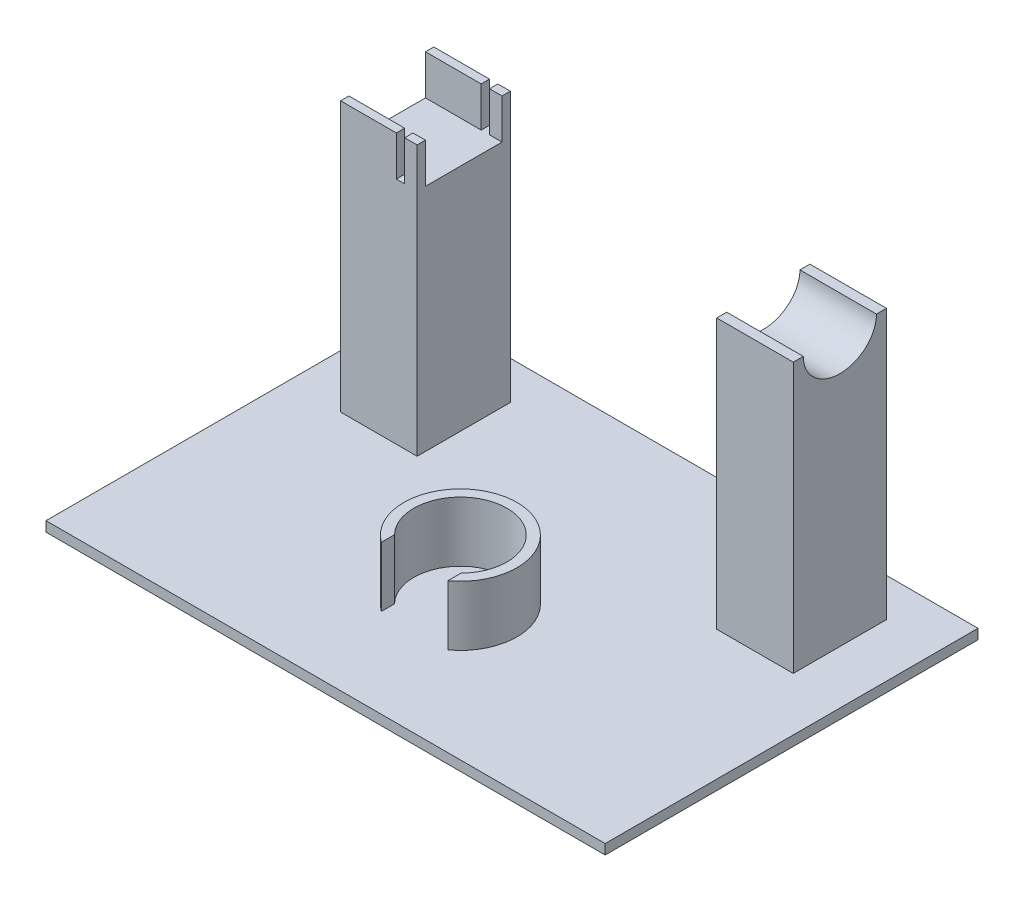
ISO-10303-21;
HEADER;
FILE_DESCRIPTION(('STEP AP214'),'2;1');
FILE_NAME('part.step','',(''),(''),'','','');
FILE_SCHEMA(('AUTOMOTIVE_DESIGN { 1 0 10303 214 1 1 1 1 }'));
ENDSEC;
DATA;
#1=APPLICATION_CONTEXT('core data for automotive mechanical design processes');
#2=APPLICATION_PROTOCOL_DEFINITION('international standard','automotive_design',2000,#1);
#3=PRODUCT_CONTEXT('',#1,'mechanical');
#4=PRODUCT('Part','Part','',(#3));
#5=PRODUCT_RELATED_PRODUCT_CATEGORY('part','',(#4));
#6=PRODUCT_DEFINITION_FORMATION('','',#4);
#7=PRODUCT_DEFINITION_CONTEXT('part definition',#1,'design');
#8=PRODUCT_DEFINITION('design','',#6,#7);
#9=PRODUCT_DEFINITION_SHAPE('','',#8);
#10=(LENGTH_UNIT() NAMED_UNIT(*) SI_UNIT(.MILLI.,.METRE.));
#11=(NAMED_UNIT(*) PLANE_ANGLE_UNIT() SI_UNIT($,.RADIAN.));
#12=(NAMED_UNIT(*) SI_UNIT($,.STERADIAN.) SOLID_ANGLE_UNIT());
#13=UNCERTAINTY_MEASURE_WITH_UNIT(LENGTH_MEASURE(1.E-05),#10,'distance_accuracy_value','');
#14=(GEOMETRIC_REPRESENTATION_CONTEXT(3) GLOBAL_UNCERTAINTY_ASSIGNED_CONTEXT((#13)) GLOBAL_UNIT_ASSIGNED_CONTEXT((#10,
#11,#12)) REPRESENTATION_CONTEXT('',''));
#15=CARTESIAN_POINT('',(0.,0.,0.));
#16=DIRECTION('',(0.,0.,1.));
#17=DIRECTION('',(1.,0.,0.));
#18=AXIS2_PLACEMENT_3D('',#15,#16,#17);
#19=CARTESIAN_POINT('',(0.,84.,0.));
#20=DIRECTION('',(0.,1.,0.));
#21=DIRECTION('',(0.,0.,1.));
#22=AXIS2_PLACEMENT_3D('',#19,#20,#21);
#23=PLANE('',#22);
#24=DIRECTION('',(-1.,0.,0.));
#25=VECTOR('',#24,1.);
#26=CARTESIAN_POINT('',(85.,84.,-41.5));
#27=LINE('',#26,#25);
#28=CARTESIAN_POINT('',(68.,84.,-41.5));
#29=VERTEX_POINT('',#28);
#30=CARTESIAN_POINT('',(45.,84.,-41.5));
#31=VERTEX_POINT('',#30);
#32=EDGE_CURVE('E45',#29,#31,#27,.T.);
#33=ORIENTED_EDGE('',*,*,#32,.F.);
#34=DIRECTION('',(0.,0.,1.));
#35=VECTOR('',#34,1.);
#36=CARTESIAN_POINT('',(68.,84.,-44.5));
#37=LINE('',#36,#35);
#38=CARTESIAN_POINT('',(68.,84.,-44.5));
#39=VERTEX_POINT('',#38);
#40=EDGE_CURVE('E374',#39,#29,#37,.T.);
#41=ORIENTED_EDGE('',*,*,#40,.F.);
#42=DIRECTION('',(-1.,0.,0.));
#43=VECTOR('',#42,1.);
#44=CARTESIAN_POINT('',(68.,84.,-44.5));
#45=LINE('',#44,#43);
#46=CARTESIAN_POINT('',(45.,84.,-44.5));
#47=VERTEX_POINT('',#46);
#48=EDGE_CURVE('E384',#39,#47,#45,.T.);
#49=ORIENTED_EDGE('',*,*,#48,.T.);
#50=DIRECTION('',(0.,0.,1.));
#51=VECTOR('',#50,1.);
#52=CARTESIAN_POINT('',(45.,84.,-44.5));
#53=LINE('',#52,#51);
#54=EDGE_CURVE('E376',#47,#31,#53,.T.);
#55=ORIENTED_EDGE('',*,*,#54,.T.);
#56=EDGE_LOOP('',(#33,#41,#49,#55));
#57=FACE_BOUND('',#56,.T.);
#58=ADVANCED_FACE('F37',(#57),#23,.T.);
#59=CARTESIAN_POINT('',(0.,84.,0.));
#60=DIRECTION('',(0.,1.,0.));
#61=DIRECTION('',(0.,0.,1.));
#62=AXIS2_PLACEMENT_3D('',#59,#60,#61);
#63=PLANE('',#62);
#64=DIRECTION('',(1.,0.,0.));
#65=VECTOR('',#64,1.);
#66=CARTESIAN_POINT('',(0.,84.,-42.));
#67=LINE('',#66,#65);
#68=CARTESIAN_POINT('',(-68.,84.,-42.));
#69=VERTEX_POINT('',#68);
#70=CARTESIAN_POINT('',(-51.25,84.,-42.));
#71=VERTEX_POINT('',#70);
#72=EDGE_CURVE('E488',#69,#71,#67,.T.);
#73=ORIENTED_EDGE('',*,*,#72,.T.);
#74=DIRECTION('',(0.,0.,1.));
#75=VECTOR('',#74,1.);
#76=CARTESIAN_POINT('',(-51.25,84.,-47.3449468279757));
#77=LINE('',#76,#75);
#78=CARTESIAN_POINT('',(-51.25,84.,-44.5));
#79=VERTEX_POINT('',#78);
#80=EDGE_CURVE('E578',#79,#71,#77,.T.);
#81=ORIENTED_EDGE('',*,*,#80,.F.);
#82=DIRECTION('',(1.,0.,0.));
#83=VECTOR('',#82,1.);
#84=CARTESIAN_POINT('',(-68.,84.,-44.5));
#85=LINE('',#84,#83);
#86=CARTESIAN_POINT('',(-68.,84.,-44.5));
#87=VERTEX_POINT('',#86);
#88=EDGE_CURVE('E430',#87,#79,#85,.T.);
#89=ORIENTED_EDGE('',*,*,#88,.F.);
#90=DIRECTION('',(0.,0.,1.));
#91=VECTOR('',#90,1.);
#92=CARTESIAN_POINT('',(-68.,84.,-44.5));
#93=LINE('',#92,#91);
#94=EDGE_CURVE('E417',#87,#69,#93,.T.);
#95=ORIENTED_EDGE('',*,*,#94,.T.);
#96=EDGE_LOOP('',(#73,#81,#89,#95));
#97=FACE_BOUND('',#96,.T.);
#98=ADVANCED_FACE('F326',(#97),#63,.T.);
#99=CARTESIAN_POINT('',(-68.,84.,-16.5));
#100=DIRECTION('',(0.,0.,-1.));
#101=DIRECTION('',(-1.,0.,0.));
#102=AXIS2_PLACEMENT_3D('',#99,#100,#101);
#103=PLANE('',#102);
#104=DIRECTION('',(0.,-1.,0.));
#105=VECTOR('',#104,1.);
#106=CARTESIAN_POINT('',(-51.25,84.,-16.5));
#107=LINE('',#106,#105);
#108=CARTESIAN_POINT('',(-51.25,84.,-16.5));
#109=VERTEX_POINT('',#108);
#110=CARTESIAN_POINT('',(-51.25,72.,-16.5));
#111=VERTEX_POINT('',#110);
#112=EDGE_CURVE('E563',#109,#111,#107,.T.);
#113=ORIENTED_EDGE('',*,*,#112,.F.);
#114=DIRECTION('',(1.,0.,0.));
#115=VECTOR('',#114,1.);
#116=CARTESIAN_POINT('',(-68.,84.,-16.5));
#117=LINE('',#116,#115);
#118=CARTESIAN_POINT('',(-68.,84.,-16.5));
#119=VERTEX_POINT('',#118);
#120=EDGE_CURVE('E422',#119,#109,#117,.T.);
#121=ORIENTED_EDGE('',*,*,#120,.F.);
#122=DIRECTION('',(0.,-1.,0.));
#123=VECTOR('',#122,1.);
#124=CARTESIAN_POINT('',(-68.,84.,-16.5));
#125=LINE('',#124,#123);
#126=CARTESIAN_POINT('',(-68.,3.,-16.5));
#127=VERTEX_POINT('',#126);
#128=EDGE_CURVE('E451',#119,#127,#125,.T.);
#129=ORIENTED_EDGE('',*,*,#128,.T.);
#130=DIRECTION('',(1.,0.,0.));
#131=VECTOR('',#130,1.);
#132=CARTESIAN_POINT('',(-68.,3.,-16.5));
#133=LINE('',#132,#131);
#134=CARTESIAN_POINT('',(-45.,3.,-16.5));
#135=VERTEX_POINT('',#134);
#136=EDGE_CURVE('E436',#127,#135,#133,.T.);
#137=ORIENTED_EDGE('',*,*,#136,.T.);
#138=DIRECTION('',(0.,-1.,0.));
#139=VECTOR('',#138,1.);
#140=CARTESIAN_POINT('',(-45.,84.,-16.5));
#141=LINE('',#140,#139);
#142=CARTESIAN_POINT('',(-45.,84.,-16.5));
#143=VERTEX_POINT('',#142);
#144=EDGE_CURVE('E449',#143,#135,#141,.T.);
#145=ORIENTED_EDGE('',*,*,#144,.F.);
#146=CARTESIAN_POINT('',(-48.75,84.,-16.5));
#147=VERTEX_POINT('',#146);
#148=EDGE_CURVE('E420',#147,#143,#117,.T.);
#149=ORIENTED_EDGE('',*,*,#148,.F.);
#150=DIRECTION('',(0.,-1.,0.));
#151=VECTOR('',#150,1.);
#152=CARTESIAN_POINT('',(-48.75,84.,-16.5));
#153=LINE('',#152,#151);
#154=CARTESIAN_POINT('',(-48.75,72.,-16.5));
#155=VERTEX_POINT('',#154);
#156=EDGE_CURVE('E576',#147,#155,#153,.T.);
#157=ORIENTED_EDGE('',*,*,#156,.T.);
#158=DIRECTION('',(-1.,0.,0.));
#159=VECTOR('',#158,1.);
#160=CARTESIAN_POINT('',(-68.,72.,-16.5));
#161=LINE('',#160,#159);
#162=EDGE_CURVE('E565',#155,#111,#161,.T.);
#163=ORIENTED_EDGE('',*,*,#162,.T.);
#164=EDGE_LOOP('',(#113,#121,#129,#137,#145,#149,#157,#163));
#165=FACE_BOUND('',#164,.T.);
#166=ADVANCED_FACE('F332',(#165),#103,.F.);
#167=CARTESIAN_POINT('',(-68.,84.,-44.5));
#168=DIRECTION('',(0.,0.,-1.));
#169=DIRECTION('',(-1.,0.,0.));
#170=AXIS2_PLACEMENT_3D('',#167,#168,#169);
#171=PLANE('',#170);
#172=ORIENTED_EDGE('',*,*,#88,.T.);
#173=DIRECTION('',(0.,-1.,0.));
#174=VECTOR('',#173,1.);
#175=CARTESIAN_POINT('',(-51.25,84.,-44.5));
#176=LINE('',#175,#174);
#177=CARTESIAN_POINT('',(-51.25,72.,-44.5));
#178=VERTEX_POINT('',#177);
#179=EDGE_CURVE('E567',#79,#178,#176,.T.);
#180=ORIENTED_EDGE('',*,*,#179,.T.);
#181=DIRECTION('',(-1.,0.,0.));
#182=VECTOR('',#181,1.);
#183=CARTESIAN_POINT('',(-68.,72.,-44.5));
#184=LINE('',#183,#182);
#185=CARTESIAN_POINT('',(-48.75,72.,-44.5));
#186=VERTEX_POINT('',#185);
#187=EDGE_CURVE('E580',#186,#178,#184,.T.);
#188=ORIENTED_EDGE('',*,*,#187,.F.);
#189=DIRECTION('',(0.,-1.,0.));
#190=VECTOR('',#189,1.);
#191=CARTESIAN_POINT('',(-48.75,84.,-44.5));
#192=LINE('',#191,#190);
#193=CARTESIAN_POINT('',(-48.75,84.,-44.5));
#194=VERTEX_POINT('',#193);
#195=EDGE_CURVE('E596',#194,#186,#192,.T.);
#196=ORIENTED_EDGE('',*,*,#195,.F.);
#197=CARTESIAN_POINT('',(-45.,84.,-44.5));
#198=VERTEX_POINT('',#197);
#199=EDGE_CURVE('E429',#194,#198,#85,.T.);
#200=ORIENTED_EDGE('',*,*,#199,.T.);
#201=DIRECTION('',(0.,-1.,0.));
#202=VECTOR('',#201,1.);
#203=CARTESIAN_POINT('',(-45.,84.,-44.5));
#204=LINE('',#203,#202);
#205=CARTESIAN_POINT('',(-45.,3.,-44.5));
#206=VERTEX_POINT('',#205);
#207=EDGE_CURVE('E446',#198,#206,#204,.T.);
#208=ORIENTED_EDGE('',*,*,#207,.T.);
#209=DIRECTION('',(1.,0.,0.));
#210=VECTOR('',#209,1.);
#211=CARTESIAN_POINT('',(-68.,3.,-44.5));
#212=LINE('',#211,#210);
#213=CARTESIAN_POINT('',(-68.,3.,-44.5));
#214=VERTEX_POINT('',#213);
#215=EDGE_CURVE('E442',#214,#206,#212,.T.);
#216=ORIENTED_EDGE('',*,*,#215,.F.);
#217=DIRECTION('',(0.,-1.,0.));
#218=VECTOR('',#217,1.);
#219=CARTESIAN_POINT('',(-68.,84.,-44.5));
#220=LINE('',#219,#218);
#221=EDGE_CURVE('E433',#87,#214,#220,.T.);
#222=ORIENTED_EDGE('',*,*,#221,.F.);
#223=EDGE_LOOP('',(#172,#180,#188,#196,#200,#208,#216,#222));
#224=FACE_BOUND('',#223,.T.);
#225=ADVANCED_FACE('F328',(#224),#171,.T.);
#226=ORIENTED_EDGE('',*,*,#120,.T.);
#227=CARTESIAN_POINT('',(-51.25,84.,-19.));
#228=VERTEX_POINT('',#227);
#229=EDGE_CURVE('E608',#228,#109,#77,.T.);
#230=ORIENTED_EDGE('',*,*,#229,.F.);
#231=DIRECTION('',(1.,0.,0.));
#232=VECTOR('',#231,1.);
#233=CARTESIAN_POINT('',(0.,84.,-19.));
#234=LINE('',#233,#232);
#235=CARTESIAN_POINT('',(-68.,84.,-19.));
#236=VERTEX_POINT('',#235);
#237=EDGE_CURVE('E484',#236,#228,#234,.T.);
#238=ORIENTED_EDGE('',*,*,#237,.F.);
#239=EDGE_CURVE('E421',#236,#119,#93,.T.);
#240=ORIENTED_EDGE('',*,*,#239,.T.);
#241=EDGE_LOOP('',(#226,#230,#238,#240));
#242=FACE_BOUND('',#241,.T.);
#243=ADVANCED_FACE('F331',(#242),#63,.T.);
#244=CARTESIAN_POINT('',(-73.,72.,-42.));
#245=DIRECTION('',(0.,0.,1.));
#246=DIRECTION('',(1.,0.,0.));
#247=AXIS2_PLACEMENT_3D('',#244,#245,#246);
#248=PLANE('',#247);
#249=DIRECTION('',(1.,0.,0.));
#250=VECTOR('',#249,1.);
#251=CARTESIAN_POINT('',(-73.,72.,-42.));
#252=LINE('',#251,#250);
#253=CARTESIAN_POINT('',(-68.,72.,-42.));
#254=VERTEX_POINT('',#253);
#255=CARTESIAN_POINT('',(-51.25,72.,-42.));
#256=VERTEX_POINT('',#255);
#257=EDGE_CURVE('E540',#254,#256,#252,.T.);
#258=ORIENTED_EDGE('',*,*,#257,.T.);
#259=DIRECTION('',(0.,1.,0.));
#260=VECTOR('',#259,1.);
#261=CARTESIAN_POINT('',(-51.25,72.,-42.));
#262=LINE('',#261,#260);
#263=EDGE_CURVE('E570',#256,#71,#262,.T.);
#264=ORIENTED_EDGE('',*,*,#263,.T.);
#265=ORIENTED_EDGE('',*,*,#72,.F.);
#266=DIRECTION('',(0.,-1.,0.));
#267=VECTOR('',#266,1.);
#268=CARTESIAN_POINT('',(-68.,84.,-42.));
#269=LINE('',#268,#267);
#270=EDGE_CURVE('E537',#69,#254,#269,.T.);
#271=ORIENTED_EDGE('',*,*,#270,.T.);
#272=EDGE_LOOP('',(#258,#264,#265,#271));
#273=FACE_BOUND('',#272,.T.);
#274=ADVANCED_FACE('F297',(#273),#248,.T.);
#275=CARTESIAN_POINT('',(-73.,72.,-19.));
#276=DIRECTION('',(0.,0.,1.));
#277=DIRECTION('',(1.,0.,0.));
#278=AXIS2_PLACEMENT_3D('',#275,#276,#277);
#279=PLANE('',#278);
#280=DIRECTION('',(0.,1.,0.));
#281=VECTOR('',#280,1.);
#282=CARTESIAN_POINT('',(-51.25,72.,-19.));
#283=LINE('',#282,#281);
#284=CARTESIAN_POINT('',(-51.25,72.,-19.));
#285=VERTEX_POINT('',#284);
#286=EDGE_CURVE('E494',#285,#228,#283,.T.);
#287=ORIENTED_EDGE('',*,*,#286,.F.);
#288=DIRECTION('',(1.,0.,0.));
#289=VECTOR('',#288,1.);
#290=CARTESIAN_POINT('',(-73.,72.,-19.));
#291=LINE('',#290,#289);
#292=CARTESIAN_POINT('',(-68.,72.,-19.));
#293=VERTEX_POINT('',#292);
#294=EDGE_CURVE('E551',#293,#285,#291,.T.);
#295=ORIENTED_EDGE('',*,*,#294,.F.);
#296=DIRECTION('',(0.,-1.,0.));
#297=VECTOR('',#296,1.);
#298=CARTESIAN_POINT('',(-68.,84.,-19.));
#299=LINE('',#298,#297);
#300=EDGE_CURVE('E533',#236,#293,#299,.T.);
#301=ORIENTED_EDGE('',*,*,#300,.F.);
#302=ORIENTED_EDGE('',*,*,#237,.T.);
#303=EDGE_LOOP('',(#287,#295,#301,#302));
#304=FACE_BOUND('',#303,.T.);
#305=ADVANCED_FACE('F301',(#304),#279,.F.);
#306=CARTESIAN_POINT('',(-68.,84.,-44.5));
#307=DIRECTION('',(1.,0.,0.));
#308=DIRECTION('',(0.,0.,-1.));
#309=AXIS2_PLACEMENT_3D('',#306,#307,#308);
#310=PLANE('',#309);
#311=ORIENTED_EDGE('',*,*,#270,.F.);
#312=ORIENTED_EDGE('',*,*,#94,.F.);
#313=ORIENTED_EDGE('',*,*,#221,.T.);
#314=DIRECTION('',(0.,0.,1.));
#315=VECTOR('',#314,1.);
#316=CARTESIAN_POINT('',(-68.,3.,-44.5));
#317=LINE('',#316,#315);
#318=EDGE_CURVE('E416',#214,#127,#317,.T.);
#319=ORIENTED_EDGE('',*,*,#318,.T.);
#320=ORIENTED_EDGE('',*,*,#128,.F.);
#321=ORIENTED_EDGE('',*,*,#239,.F.);
#322=ORIENTED_EDGE('',*,*,#300,.T.);
#323=DIRECTION('',(0.,0.,1.));
#324=VECTOR('',#323,1.);
#325=CARTESIAN_POINT('',(-68.,72.,-44.5));
#326=LINE('',#325,#324);
#327=EDGE_CURVE('E391',#254,#293,#326,.T.);
#328=ORIENTED_EDGE('',*,*,#327,.F.);
#329=EDGE_LOOP('',(#311,#312,#313,#319,#320,#321,#322,#328));
#330=FACE_BOUND('',#329,.T.);
#331=ADVANCED_FACE('F337',(#330),#310,.F.);
#332=CARTESIAN_POINT('',(-45.,84.,-44.5));
#333=DIRECTION('',(1.,0.,0.));
#334=DIRECTION('',(0.,0.,-1.));
#335=AXIS2_PLACEMENT_3D('',#332,#333,#334);
#336=PLANE('',#335);
#337=DIRECTION('',(0.,0.,1.));
#338=VECTOR('',#337,1.);
#339=CARTESIAN_POINT('',(-45.,84.,-44.5));
#340=LINE('',#339,#338);
#341=CARTESIAN_POINT('',(-45.,84.,-42.));
#342=VERTEX_POINT('',#341);
#343=EDGE_CURVE('E426',#198,#342,#340,.T.);
#344=ORIENTED_EDGE('',*,*,#343,.T.);
#345=DIRECTION('',(0.,1.,0.));
#346=VECTOR('',#345,1.);
#347=CARTESIAN_POINT('',(-45.,72.,-42.));
#348=LINE('',#347,#346);
#349=CARTESIAN_POINT('',(-45.,72.,-42.));
#350=VERTEX_POINT('',#349);
#351=EDGE_CURVE('E528',#350,#342,#348,.T.);
#352=ORIENTED_EDGE('',*,*,#351,.F.);
#353=DIRECTION('',(0.,0.,1.));
#354=VECTOR('',#353,1.);
#355=CARTESIAN_POINT('',(-45.,72.,-42.));
#356=LINE('',#355,#354);
#357=CARTESIAN_POINT('',(-45.,72.,-19.));
#358=VERTEX_POINT('',#357);
#359=EDGE_CURVE('E555',#350,#358,#356,.T.);
#360=ORIENTED_EDGE('',*,*,#359,.T.);
#361=DIRECTION('',(0.,1.,0.));
#362=VECTOR('',#361,1.);
#363=CARTESIAN_POINT('',(-45.,72.,-19.));
#364=LINE('',#363,#362);
#365=CARTESIAN_POINT('',(-45.,84.,-19.));
#366=VERTEX_POINT('',#365);
#367=EDGE_CURVE('E534',#358,#366,#364,.T.);
#368=ORIENTED_EDGE('',*,*,#367,.T.);
#369=EDGE_CURVE('E425',#366,#143,#340,.T.);
#370=ORIENTED_EDGE('',*,*,#369,.T.);
#371=ORIENTED_EDGE('',*,*,#144,.T.);
#372=DIRECTION('',(0.,0.,1.));
#373=VECTOR('',#372,1.);
#374=CARTESIAN_POINT('',(-45.,3.,-44.5));
#375=LINE('',#374,#373);
#376=EDGE_CURVE('E439',#206,#135,#375,.T.);
#377=ORIENTED_EDGE('',*,*,#376,.F.);
#378=ORIENTED_EDGE('',*,*,#207,.F.);
#379=EDGE_LOOP('',(#344,#352,#360,#368,#370,#371,#377,#378));
#380=FACE_BOUND('',#379,.T.);
#381=ADVANCED_FACE('F334',(#380),#336,.T.);
#382=DIRECTION('',(0.,0.,1.));
#383=VECTOR('',#382,1.);
#384=CARTESIAN_POINT('',(-48.75,84.,-47.3449468279757));
#385=LINE('',#384,#383);
#386=CARTESIAN_POINT('',(-48.75,84.,-42.));
#387=VERTEX_POINT('',#386);
#388=EDGE_CURVE('E526',#194,#387,#385,.T.);
#389=ORIENTED_EDGE('',*,*,#388,.T.);
#390=EDGE_CURVE('E487',#387,#342,#67,.T.);
#391=ORIENTED_EDGE('',*,*,#390,.T.);
#392=ORIENTED_EDGE('',*,*,#343,.F.);
#393=ORIENTED_EDGE('',*,*,#199,.F.);
#394=EDGE_LOOP('',(#389,#391,#392,#393));
#395=FACE_BOUND('',#394,.T.);
#396=ADVANCED_FACE('F327',(#395),#63,.T.);
#397=CARTESIAN_POINT('',(0.,3.,0.));
#398=DIRECTION('',(0.,-1.,0.));
#399=DIRECTION('',(0.,0.,-1.));
#400=AXIS2_PLACEMENT_3D('',#397,#398,#399);
#401=PLANE('',#400);
#402=CARTESIAN_POINT('',(0.,3.,15.5));
#403=DIRECTION('',(0.,-1.,0.));
#404=DIRECTION('',(0.,0.,-1.));
#405=AXIS2_PLACEMENT_3D('',#402,#403,#404);
#406=CIRCLE('',#405,17.);
#407=CARTESIAN_POINT('',(10.,3.,29.2477270848675));
#408=VERTEX_POINT('',#407);
#409=CARTESIAN_POINT('',(-10.,3.,29.2477270848675));
#410=VERTEX_POINT('',#409);
#411=EDGE_CURVE('E11',#408,#410,#406,.F.);
#412=ORIENTED_EDGE('',*,*,#411,.F.);
#413=DIRECTION('',(0.,0.,-1.));
#414=VECTOR('',#413,1.);
#415=CARTESIAN_POINT('',(10.,3.,19.5960604290662));
#416=LINE('',#415,#414);
#417=CARTESIAN_POINT('',(10.,3.,25.2979589711327));
#418=VERTEX_POINT('',#417);
#419=EDGE_CURVE('E52',#408,#418,#416,.T.);
#420=ORIENTED_EDGE('',*,*,#419,.T.);
#421=CARTESIAN_POINT('',(0.,3.,15.5));
#422=DIRECTION('',(0.,1.,0.));
#423=DIRECTION('',(0.,0.,1.));
#424=AXIS2_PLACEMENT_3D('',#421,#422,#423);
#425=CIRCLE('',#424,14.);
#426=CARTESIAN_POINT('',(-10.,3.,25.2979589711327));
#427=VERTEX_POINT('',#426);
#428=EDGE_CURVE('E259',#418,#427,#425,.T.);
#429=ORIENTED_EDGE('',*,*,#428,.T.);
#430=DIRECTION('',(0.,0.,1.));
#431=VECTOR('',#430,1.);
#432=CARTESIAN_POINT('',(-10.,3.,19.5960604290662));
#433=LINE('',#432,#431);
#434=EDGE_CURVE('E240',#427,#410,#433,.T.);
#435=ORIENTED_EDGE('',*,*,#434,.T.);
#436=EDGE_LOOP('',(#412,#420,#429,#435));
#437=FACE_BOUND('',#436,.T.);
#438=DIRECTION('',(-1.,0.,0.));
#439=VECTOR('',#438,1.);
#440=CARTESIAN_POINT('',(68.,3.,-44.5));
#441=LINE('',#440,#439);
#442=CARTESIAN_POINT('',(68.,3.,-44.5));
#443=VERTEX_POINT('',#442);
#444=CARTESIAN_POINT('',(45.,3.,-44.5));
#445=VERTEX_POINT('',#444);
#446=EDGE_CURVE('E402',#443,#445,#441,.T.);
#447=ORIENTED_EDGE('',*,*,#446,.F.);
#448=DIRECTION('',(0.,0.,1.));
#449=VECTOR('',#448,1.);
#450=CARTESIAN_POINT('',(68.,3.,-44.5));
#451=LINE('',#450,#449);
#452=CARTESIAN_POINT('',(68.,3.,-16.5));
#453=VERTEX_POINT('',#452);
#454=EDGE_CURVE('E399',#443,#453,#451,.T.);
#455=ORIENTED_EDGE('',*,*,#454,.T.);
#456=DIRECTION('',(-1.,0.,0.));
#457=VECTOR('',#456,1.);
#458=CARTESIAN_POINT('',(68.,3.,-16.5));
#459=LINE('',#458,#457);
#460=CARTESIAN_POINT('',(45.,3.,-16.5));
#461=VERTEX_POINT('',#460);
#462=EDGE_CURVE('E389',#453,#461,#459,.T.);
#463=ORIENTED_EDGE('',*,*,#462,.T.);
#464=DIRECTION('',(0.,0.,1.));
#465=VECTOR('',#464,1.);
#466=CARTESIAN_POINT('',(45.,3.,-44.5));
#467=LINE('',#466,#465);
#468=EDGE_CURVE('E404',#445,#461,#467,.T.);
#469=ORIENTED_EDGE('',*,*,#468,.F.);
#470=EDGE_LOOP('',(#447,#455,#463,#469));
#471=FACE_BOUND('',#470,.T.);
#472=DIRECTION('',(1.,0.,0.));
#473=VECTOR('',#472,1.);
#474=CARTESIAN_POINT('',(-84.,3.,-56.));
#475=LINE('',#474,#473);
#476=CARTESIAN_POINT('',(-84.,3.,-56.));
#477=VERTEX_POINT('',#476);
#478=CARTESIAN_POINT('',(84.,3.,-56.));
#479=VERTEX_POINT('',#478);
#480=EDGE_CURVE('E454',#477,#479,#475,.T.);
#481=ORIENTED_EDGE('',*,*,#480,.F.);
#482=DIRECTION('',(0.,0.,1.));
#483=VECTOR('',#482,1.);
#484=CARTESIAN_POINT('',(-84.,3.,-56.));
#485=LINE('',#484,#483);
#486=CARTESIAN_POINT('',(-84.,3.,56.));
#487=VERTEX_POINT('',#486);
#488=EDGE_CURVE('E463',#477,#487,#485,.T.);
#489=ORIENTED_EDGE('',*,*,#488,.T.);
#490=DIRECTION('',(1.,0.,0.));
#491=VECTOR('',#490,1.);
#492=CARTESIAN_POINT('',(-84.,3.,56.));
#493=LINE('',#492,#491);
#494=CARTESIAN_POINT('',(84.,3.,56.));
#495=VERTEX_POINT('',#494);
#496=EDGE_CURVE('E461',#487,#495,#493,.T.);
#497=ORIENTED_EDGE('',*,*,#496,.T.);
#498=DIRECTION('',(0.,0.,1.));
#499=VECTOR('',#498,1.);
#500=CARTESIAN_POINT('',(84.,3.,-56.));
#501=LINE('',#500,#499);
#502=EDGE_CURVE('E457',#479,#495,#501,.T.);
#503=ORIENTED_EDGE('',*,*,#502,.F.);
#504=EDGE_LOOP('',(#481,#489,#497,#503));
#505=FACE_BOUND('',#504,.T.);
#506=ORIENTED_EDGE('',*,*,#318,.F.);
#507=ORIENTED_EDGE('',*,*,#215,.T.);
#508=ORIENTED_EDGE('',*,*,#376,.T.);
#509=ORIENTED_EDGE('',*,*,#136,.F.);
#510=EDGE_LOOP('',(#506,#507,#508,#509));
#511=FACE_BOUND('',#510,.T.);
#512=ADVANCED_FACE('F345',(#437,#471,#505,#511),#401,.F.);
#513=CARTESIAN_POINT('',(-84.,3.,-56.));
#514=DIRECTION('',(0.,0.,-1.));
#515=DIRECTION('',(-1.,0.,0.));
#516=AXIS2_PLACEMENT_3D('',#513,#514,#515);
#517=PLANE('',#516);
#518=DIRECTION('',(1.,0.,0.));
#519=VECTOR('',#518,1.);
#520=CARTESIAN_POINT('',(-84.,0.,-56.));
#521=LINE('',#520,#519);
#522=CARTESIAN_POINT('',(-84.,0.,-56.));
#523=VERTEX_POINT('',#522);
#524=CARTESIAN_POINT('',(84.,0.,-56.));
#525=VERTEX_POINT('',#524);
#526=EDGE_CURVE('E453',#523,#525,#521,.T.);
#527=ORIENTED_EDGE('',*,*,#526,.F.);
#528=DIRECTION('',(0.,-1.,0.));
#529=VECTOR('',#528,1.);
#530=CARTESIAN_POINT('',(-84.,3.,-56.));
#531=LINE('',#530,#529);
#532=EDGE_CURVE('E475',#477,#523,#531,.T.);
#533=ORIENTED_EDGE('',*,*,#532,.F.);
#534=ORIENTED_EDGE('',*,*,#480,.T.);
#535=DIRECTION('',(0.,-1.,0.));
#536=VECTOR('',#535,1.);
#537=CARTESIAN_POINT('',(84.,3.,-56.));
#538=LINE('',#537,#536);
#539=EDGE_CURVE('E465',#479,#525,#538,.T.);
#540=ORIENTED_EDGE('',*,*,#539,.T.);
#541=EDGE_LOOP('',(#527,#533,#534,#540));
#542=FACE_BOUND('',#541,.T.);
#543=ADVANCED_FACE('F39',(#542),#517,.T.);
#544=CARTESIAN_POINT('',(-84.,3.,-56.));
#545=DIRECTION('',(1.,0.,0.));
#546=DIRECTION('',(0.,0.,-1.));
#547=AXIS2_PLACEMENT_3D('',#544,#545,#546);
#548=PLANE('',#547);
#549=DIRECTION('',(0.,0.,1.));
#550=VECTOR('',#549,1.);
#551=CARTESIAN_POINT('',(-84.,0.,-56.));
#552=LINE('',#551,#550);
#553=CARTESIAN_POINT('',(-84.,0.,56.));
#554=VERTEX_POINT('',#553);
#555=EDGE_CURVE('E458',#523,#554,#552,.T.);
#556=ORIENTED_EDGE('',*,*,#555,.T.);
#557=DIRECTION('',(0.,-1.,0.));
#558=VECTOR('',#557,1.);
#559=CARTESIAN_POINT('',(-84.,3.,56.));
#560=LINE('',#559,#558);
#561=EDGE_CURVE('E478',#487,#554,#560,.T.);
#562=ORIENTED_EDGE('',*,*,#561,.F.);
#563=ORIENTED_EDGE('',*,*,#488,.F.);
#564=ORIENTED_EDGE('',*,*,#532,.T.);
#565=EDGE_LOOP('',(#556,#562,#563,#564));
#566=FACE_BOUND('',#565,.T.);
#567=ADVANCED_FACE('F352',(#566),#548,.F.);
#568=CARTESIAN_POINT('',(-84.,3.,56.));
#569=DIRECTION('',(0.,0.,-1.));
#570=DIRECTION('',(-1.,0.,0.));
#571=AXIS2_PLACEMENT_3D('',#568,#569,#570);
#572=PLANE('',#571);
#573=DIRECTION('',(1.,0.,0.));
#574=VECTOR('',#573,1.);
#575=CARTESIAN_POINT('',(-84.,0.,56.));
#576=LINE('',#575,#574);
#577=CARTESIAN_POINT('',(84.,0.,56.));
#578=VERTEX_POINT('',#577);
#579=EDGE_CURVE('E471',#554,#578,#576,.T.);
#580=ORIENTED_EDGE('',*,*,#579,.T.);
#581=DIRECTION('',(0.,-1.,0.));
#582=VECTOR('',#581,1.);
#583=CARTESIAN_POINT('',(84.,3.,56.));
#584=LINE('',#583,#582);
#585=EDGE_CURVE('E481',#495,#578,#584,.T.);
#586=ORIENTED_EDGE('',*,*,#585,.F.);
#587=ORIENTED_EDGE('',*,*,#496,.F.);
#588=ORIENTED_EDGE('',*,*,#561,.T.);
#589=EDGE_LOOP('',(#580,#586,#587,#588));
#590=FACE_BOUND('',#589,.T.);
#591=ADVANCED_FACE('F355',(#590),#572,.F.);
#592=CARTESIAN_POINT('',(84.,3.,-56.));
#593=DIRECTION('',(1.,0.,0.));
#594=DIRECTION('',(0.,0.,-1.));
#595=AXIS2_PLACEMENT_3D('',#592,#593,#594);
#596=PLANE('',#595);
#597=DIRECTION('',(0.,0.,1.));
#598=VECTOR('',#597,1.);
#599=CARTESIAN_POINT('',(84.,0.,-56.));
#600=LINE('',#599,#598);
#601=EDGE_CURVE('E468',#525,#578,#600,.T.);
#602=ORIENTED_EDGE('',*,*,#601,.F.);
#603=ORIENTED_EDGE('',*,*,#539,.F.);
#604=ORIENTED_EDGE('',*,*,#502,.T.);
#605=ORIENTED_EDGE('',*,*,#585,.T.);
#606=EDGE_LOOP('',(#602,#603,#604,#605));
#607=FACE_BOUND('',#606,.T.);
#608=ADVANCED_FACE('F350',(#607),#596,.T.);
#609=CARTESIAN_POINT('',(0.,0.,0.));
#610=DIRECTION('',(0.,-1.,0.));
#611=DIRECTION('',(0.,0.,-1.));
#612=AXIS2_PLACEMENT_3D('',#609,#610,#611);
#613=PLANE('',#612);
#614=ORIENTED_EDGE('',*,*,#526,.T.);
#615=ORIENTED_EDGE('',*,*,#601,.T.);
#616=ORIENTED_EDGE('',*,*,#579,.F.);
#617=ORIENTED_EDGE('',*,*,#555,.F.);
#618=EDGE_LOOP('',(#614,#615,#616,#617));
#619=FACE_BOUND('',#618,.T.);
#620=ADVANCED_FACE('F324',(#619),#613,.T.);
#621=CARTESIAN_POINT('',(-48.75,84.,-19.));
#622=VERTEX_POINT('',#621);
#623=EDGE_CURVE('E582',#622,#147,#385,.T.);
#624=ORIENTED_EDGE('',*,*,#623,.T.);
#625=ORIENTED_EDGE('',*,*,#148,.T.);
#626=ORIENTED_EDGE('',*,*,#369,.F.);
#627=EDGE_CURVE('E477',#622,#366,#234,.T.);
#628=ORIENTED_EDGE('',*,*,#627,.F.);
#629=EDGE_LOOP('',(#624,#625,#626,#628));
#630=FACE_BOUND('',#629,.T.);
#631=ADVANCED_FACE('F320',(#630),#63,.T.);
#632=CARTESIAN_POINT('',(68.,84.,-44.5));
#633=DIRECTION('',(1.,0.,0.));
#634=DIRECTION('',(0.,0.,-1.));
#635=AXIS2_PLACEMENT_3D('',#632,#633,#634);
#636=PLANE('',#635);
#637=CARTESIAN_POINT('',(68.,84.,-30.5));
#638=DIRECTION('',(-1.,0.,0.));
#639=DIRECTION('',(0.,0.,1.));
#640=AXIS2_PLACEMENT_3D('',#637,#638,#639);
#641=ELLIPSE('',#640,11.,9.99999999999999);
#642=CARTESIAN_POINT('',(68.,84.,-19.5));
#643=VERTEX_POINT('',#642);
#644=EDGE_CURVE('E379',#643,#29,#641,.F.);
#645=ORIENTED_EDGE('',*,*,#644,.F.);
#646=CARTESIAN_POINT('',(68.,84.,-16.5));
#647=VERTEX_POINT('',#646);
#648=EDGE_CURVE('E385',#643,#647,#37,.T.);
#649=ORIENTED_EDGE('',*,*,#648,.T.);
#650=DIRECTION('',(0.,-1.,0.));
#651=VECTOR('',#650,1.);
#652=CARTESIAN_POINT('',(68.,84.,-16.5));
#653=LINE('',#652,#651);
#654=EDGE_CURVE('E398',#647,#453,#653,.T.);
#655=ORIENTED_EDGE('',*,*,#654,.T.);
#656=ORIENTED_EDGE('',*,*,#454,.F.);
#657=DIRECTION('',(0.,-1.,0.));
#658=VECTOR('',#657,1.);
#659=CARTESIAN_POINT('',(68.,84.,-44.5));
#660=LINE('',#659,#658);
#661=EDGE_CURVE('E382',#39,#443,#660,.T.);
#662=ORIENTED_EDGE('',*,*,#661,.F.);
#663=ORIENTED_EDGE('',*,*,#40,.T.);
#664=EDGE_LOOP('',(#645,#649,#655,#656,#662,#663));
#665=FACE_BOUND('',#664,.T.);
#666=ADVANCED_FACE('F316',(#665),#636,.T.);
#667=CARTESIAN_POINT('',(68.,84.,-44.5));
#668=DIRECTION('',(0.,0.,1.));
#669=DIRECTION('',(1.,0.,0.));
#670=AXIS2_PLACEMENT_3D('',#667,#668,#669);
#671=PLANE('',#670);
#672=ORIENTED_EDGE('',*,*,#446,.T.);
#673=DIRECTION('',(0.,-1.,0.));
#674=VECTOR('',#673,1.);
#675=CARTESIAN_POINT('',(45.,84.,-44.5));
#676=LINE('',#675,#674);
#677=EDGE_CURVE('E412',#47,#445,#676,.T.);
#678=ORIENTED_EDGE('',*,*,#677,.F.);
#679=ORIENTED_EDGE('',*,*,#48,.F.);
#680=ORIENTED_EDGE('',*,*,#661,.T.);
#681=EDGE_LOOP('',(#672,#678,#679,#680));
#682=FACE_BOUND('',#681,.T.);
#683=ADVANCED_FACE('F312',(#682),#671,.F.);
#684=CARTESIAN_POINT('',(45.,84.,-44.5));
#685=DIRECTION('',(1.,0.,0.));
#686=DIRECTION('',(0.,0.,-1.));
#687=AXIS2_PLACEMENT_3D('',#684,#685,#686);
#688=PLANE('',#687);
#689=CARTESIAN_POINT('',(45.,84.,-19.5));
#690=VERTEX_POINT('',#689);
#691=CARTESIAN_POINT('',(45.,84.,-16.5));
#692=VERTEX_POINT('',#691);
#693=EDGE_CURVE('E387',#690,#692,#53,.T.);
#694=ORIENTED_EDGE('',*,*,#693,.F.);
#695=CARTESIAN_POINT('',(45.,84.,-30.5));
#696=DIRECTION('',(-1.,0.,0.));
#697=DIRECTION('',(0.,0.,1.));
#698=AXIS2_PLACEMENT_3D('',#695,#696,#697);
#699=ELLIPSE('',#698,11.,9.99999999999999);
#700=EDGE_CURVE('E60',#31,#690,#699,.T.);
#701=ORIENTED_EDGE('',*,*,#700,.F.);
#702=ORIENTED_EDGE('',*,*,#54,.F.);
#703=ORIENTED_EDGE('',*,*,#677,.T.);
#704=ORIENTED_EDGE('',*,*,#468,.T.);
#705=DIRECTION('',(0.,-1.,0.));
#706=VECTOR('',#705,1.);
#707=CARTESIAN_POINT('',(45.,84.,-16.5));
#708=LINE('',#707,#706);
#709=EDGE_CURVE('E409',#692,#461,#708,.T.);
#710=ORIENTED_EDGE('',*,*,#709,.F.);
#711=EDGE_LOOP('',(#694,#701,#702,#703,#704,#710));
#712=FACE_BOUND('',#711,.T.);
#713=ADVANCED_FACE('F308',(#712),#688,.F.);
#714=CARTESIAN_POINT('',(68.,84.,-16.5));
#715=DIRECTION('',(0.,0.,1.));
#716=DIRECTION('',(1.,0.,0.));
#717=AXIS2_PLACEMENT_3D('',#714,#715,#716);
#718=PLANE('',#717);
#719=ORIENTED_EDGE('',*,*,#462,.F.);
#720=ORIENTED_EDGE('',*,*,#654,.F.);
#721=DIRECTION('',(-1.,0.,0.));
#722=VECTOR('',#721,1.);
#723=CARTESIAN_POINT('',(68.,84.,-16.5));
#724=LINE('',#723,#722);
#725=EDGE_CURVE('E395',#647,#692,#724,.T.);
#726=ORIENTED_EDGE('',*,*,#725,.T.);
#727=ORIENTED_EDGE('',*,*,#709,.T.);
#728=EDGE_LOOP('',(#719,#720,#726,#727));
#729=FACE_BOUND('',#728,.T.);
#730=ADVANCED_FACE('F304',(#729),#718,.T.);
#731=DIRECTION('',(-1.,0.,0.));
#732=VECTOR('',#731,1.);
#733=CARTESIAN_POINT('',(85.,84.,-19.5));
#734=LINE('',#733,#732);
#735=EDGE_CURVE('E377',#690,#643,#734,.F.);
#736=ORIENTED_EDGE('',*,*,#735,.F.);
#737=ORIENTED_EDGE('',*,*,#693,.T.);
#738=ORIENTED_EDGE('',*,*,#725,.F.);
#739=ORIENTED_EDGE('',*,*,#648,.F.);
#740=EDGE_LOOP('',(#736,#737,#738,#739));
#741=FACE_BOUND('',#740,.T.);
#742=ADVANCED_FACE('F291',(#741),#23,.T.);
#743=CARTESIAN_POINT('',(0.,72.,0.));
#744=DIRECTION('',(0.,1.,0.));
#745=DIRECTION('',(0.,0.,1.));
#746=AXIS2_PLACEMENT_3D('',#743,#744,#745);
#747=PLANE('',#746);
#748=CARTESIAN_POINT('',(-48.75,72.,-42.));
#749=VERTEX_POINT('',#748);
#750=EDGE_CURVE('E530',#749,#350,#252,.T.);
#751=ORIENTED_EDGE('',*,*,#750,.F.);
#752=DIRECTION('',(0.,0.,1.));
#753=VECTOR('',#752,1.);
#754=CARTESIAN_POINT('',(-48.75,72.,-47.3449468279757));
#755=LINE('',#754,#753);
#756=EDGE_CURVE('E587',#186,#749,#755,.T.);
#757=ORIENTED_EDGE('',*,*,#756,.F.);
#758=ORIENTED_EDGE('',*,*,#187,.T.);
#759=DIRECTION('',(0.,0.,1.));
#760=VECTOR('',#759,1.);
#761=CARTESIAN_POINT('',(-51.25,72.,-47.3449468279757));
#762=LINE('',#761,#760);
#763=EDGE_CURVE('E581',#178,#256,#762,.T.);
#764=ORIENTED_EDGE('',*,*,#763,.T.);
#765=ORIENTED_EDGE('',*,*,#257,.F.);
#766=ORIENTED_EDGE('',*,*,#327,.T.);
#767=ORIENTED_EDGE('',*,*,#294,.T.);
#768=EDGE_CURVE('E583',#285,#111,#762,.T.);
#769=ORIENTED_EDGE('',*,*,#768,.T.);
#770=ORIENTED_EDGE('',*,*,#162,.F.);
#771=CARTESIAN_POINT('',(-48.75,72.,-19.));
#772=VERTEX_POINT('',#771);
#773=EDGE_CURVE('E590',#772,#155,#755,.T.);
#774=ORIENTED_EDGE('',*,*,#773,.F.);
#775=EDGE_CURVE('E556',#772,#358,#291,.T.);
#776=ORIENTED_EDGE('',*,*,#775,.T.);
#777=ORIENTED_EDGE('',*,*,#359,.F.);
#778=EDGE_LOOP('',(#751,#757,#758,#764,#765,#766,#767,#769,#770,#774,#776,#777));
#779=FACE_BOUND('',#778,.T.);
#780=ADVANCED_FACE('F287',(#779),#747,.T.);
#781=DIRECTION('',(0.,1.,0.));
#782=VECTOR('',#781,1.);
#783=CARTESIAN_POINT('',(-48.75,72.,-42.));
#784=LINE('',#783,#782);
#785=EDGE_CURVE('E594',#749,#387,#784,.T.);
#786=ORIENTED_EDGE('',*,*,#785,.F.);
#787=ORIENTED_EDGE('',*,*,#750,.T.);
#788=ORIENTED_EDGE('',*,*,#351,.T.);
#789=ORIENTED_EDGE('',*,*,#390,.F.);
#790=EDGE_LOOP('',(#786,#787,#788,#789));
#791=FACE_BOUND('',#790,.T.);
#792=ADVANCED_FACE('F290',(#791),#248,.T.);
#793=ORIENTED_EDGE('',*,*,#775,.F.);
#794=DIRECTION('',(0.,1.,0.));
#795=VECTOR('',#794,1.);
#796=CARTESIAN_POINT('',(-48.75,72.,-19.));
#797=LINE('',#796,#795);
#798=EDGE_CURVE('E491',#772,#622,#797,.T.);
#799=ORIENTED_EDGE('',*,*,#798,.T.);
#800=ORIENTED_EDGE('',*,*,#627,.T.);
#801=ORIENTED_EDGE('',*,*,#367,.F.);
#802=EDGE_LOOP('',(#793,#799,#800,#801));
#803=FACE_BOUND('',#802,.T.);
#804=ADVANCED_FACE('F295',(#803),#279,.F.);
#805=CARTESIAN_POINT('',(-48.75,84.,-47.3449468279757));
#806=DIRECTION('',(1.,0.,0.));
#807=DIRECTION('',(0.,0.,-1.));
#808=AXIS2_PLACEMENT_3D('',#805,#806,#807);
#809=PLANE('',#808);
#810=ORIENTED_EDGE('',*,*,#623,.F.);
#811=ORIENTED_EDGE('',*,*,#798,.F.);
#812=ORIENTED_EDGE('',*,*,#773,.T.);
#813=ORIENTED_EDGE('',*,*,#156,.F.);
#814=EDGE_LOOP('',(#810,#811,#812,#813));
#815=FACE_BOUND('',#814,.T.);
#816=ADVANCED_FACE('F286',(#815),#809,.F.);
#817=CARTESIAN_POINT('',(-51.25,84.,-47.3449468279757));
#818=DIRECTION('',(1.,0.,0.));
#819=DIRECTION('',(0.,0.,-1.));
#820=AXIS2_PLACEMENT_3D('',#817,#818,#819);
#821=PLANE('',#820);
#822=ORIENTED_EDGE('',*,*,#112,.T.);
#823=ORIENTED_EDGE('',*,*,#768,.F.);
#824=ORIENTED_EDGE('',*,*,#286,.T.);
#825=ORIENTED_EDGE('',*,*,#229,.T.);
#826=EDGE_LOOP('',(#822,#823,#824,#825));
#827=FACE_BOUND('',#826,.T.);
#828=ADVANCED_FACE('F281',(#827),#821,.T.);
#829=ORIENTED_EDGE('',*,*,#80,.T.);
#830=ORIENTED_EDGE('',*,*,#263,.F.);
#831=ORIENTED_EDGE('',*,*,#763,.F.);
#832=ORIENTED_EDGE('',*,*,#179,.F.);
#833=EDGE_LOOP('',(#829,#830,#831,#832));
#834=FACE_BOUND('',#833,.T.);
#835=ADVANCED_FACE('F278',(#834),#821,.T.);
#836=ORIENTED_EDGE('',*,*,#195,.T.);
#837=ORIENTED_EDGE('',*,*,#756,.T.);
#838=ORIENTED_EDGE('',*,*,#785,.T.);
#839=ORIENTED_EDGE('',*,*,#388,.F.);
#840=EDGE_LOOP('',(#836,#837,#838,#839));
#841=FACE_BOUND('',#840,.T.);
#842=ADVANCED_FACE('F276',(#841),#809,.F.);
#843=CARTESIAN_POINT('',(85.,84.,-30.5));
#844=DIRECTION('',(-1.,0.,0.));
#845=DIRECTION('',(0.,0.,1.));
#846=AXIS2_PLACEMENT_3D('',#843,#844,#845);
#847=ELLIPSE('',#846,11.,9.99999999999999);
#848=DIRECTION('',(-1.,0.,0.));
#849=VECTOR('',#848,1.);
#850=SURFACE_OF_LINEAR_EXTRUSION('',#847,#849);
#851=ORIENTED_EDGE('',*,*,#32,.T.);
#852=ORIENTED_EDGE('',*,*,#700,.T.);
#853=ORIENTED_EDGE('',*,*,#735,.T.);
#854=ORIENTED_EDGE('',*,*,#644,.T.);
#855=EDGE_LOOP('',(#851,#852,#853,#854));
#856=FACE_BOUND('',#855,.T.);
#857=ADVANCED_FACE('F271',(#856),#850,.F.);
#858=CARTESIAN_POINT('',(0.,21.,15.5));
#859=DIRECTION('',(0.,-1.,0.));
#860=DIRECTION('',(0.,0.,-1.));
#861=AXIS2_PLACEMENT_3D('',#858,#859,#860);
#862=CYLINDRICAL_SURFACE('',#861,17.);
#863=CARTESIAN_POINT('',(0.,21.,15.5));
#864=DIRECTION('',(0.,1.,0.));
#865=DIRECTION('',(0.,0.,1.));
#866=AXIS2_PLACEMENT_3D('',#863,#864,#865);
#867=CIRCLE('',#866,17.);
#868=CARTESIAN_POINT('',(10.,21.,29.2477270848675));
#869=VERTEX_POINT('',#868);
#870=CARTESIAN_POINT('',(-10.,21.,29.2477270848675));
#871=VERTEX_POINT('',#870);
#872=EDGE_CURVE('E253',#869,#871,#867,.T.);
#873=ORIENTED_EDGE('',*,*,#872,.F.);
#874=DIRECTION('',(0.,-1.,0.));
#875=VECTOR('',#874,1.);
#876=CARTESIAN_POINT('',(10.,21.,29.2477270848675));
#877=LINE('',#876,#875);
#878=EDGE_CURVE('E260',#869,#408,#877,.T.);
#879=ORIENTED_EDGE('',*,*,#878,.T.);
#880=ORIENTED_EDGE('',*,*,#411,.T.);
#881=DIRECTION('',(0.,-1.,0.));
#882=VECTOR('',#881,1.);
#883=CARTESIAN_POINT('',(-10.,21.,29.2477270848675));
#884=LINE('',#883,#882);
#885=EDGE_CURVE('E244',#410,#871,#884,.F.);
#886=ORIENTED_EDGE('',*,*,#885,.T.);
#887=EDGE_LOOP('',(#873,#879,#880,#886));
#888=FACE_BOUND('',#887,.T.);
#889=ADVANCED_FACE('F275',(#888),#862,.T.);
#890=CARTESIAN_POINT('',(0.,21.,15.5));
#891=DIRECTION('',(0.,1.,0.));
#892=DIRECTION('',(0.,0.,1.));
#893=AXIS2_PLACEMENT_3D('',#890,#891,#892);
#894=PLANE('',#893);
#895=DIRECTION('',(0.,0.,-1.));
#896=VECTOR('',#895,1.);
#897=CARTESIAN_POINT('',(10.,21.,19.5960604290662));
#898=LINE('',#897,#896);
#899=CARTESIAN_POINT('',(10.,21.,25.2979589711327));
#900=VERTEX_POINT('',#899);
#901=EDGE_CURVE('E254',#869,#900,#898,.T.);
#902=ORIENTED_EDGE('',*,*,#901,.F.);
#903=ORIENTED_EDGE('',*,*,#872,.T.);
#904=DIRECTION('',(0.,0.,1.));
#905=VECTOR('',#904,1.);
#906=CARTESIAN_POINT('',(-10.,21.,19.5960604290662));
#907=LINE('',#906,#905);
#908=CARTESIAN_POINT('',(-10.,21.,25.2979589711327));
#909=VERTEX_POINT('',#908);
#910=EDGE_CURVE('E237',#909,#871,#907,.T.);
#911=ORIENTED_EDGE('',*,*,#910,.F.);
#912=CARTESIAN_POINT('',(0.,21.,15.5));
#913=DIRECTION('',(0.,1.,0.));
#914=DIRECTION('',(0.,0.,1.));
#915=AXIS2_PLACEMENT_3D('',#912,#913,#914);
#916=CIRCLE('',#915,14.);
#917=EDGE_CURVE('E251',#900,#909,#916,.T.);
#918=ORIENTED_EDGE('',*,*,#917,.F.);
#919=EDGE_LOOP('',(#902,#903,#911,#918));
#920=FACE_BOUND('',#919,.T.);
#921=ADVANCED_FACE('F250',(#920),#894,.T.);
#922=CARTESIAN_POINT('',(0.,3.,15.5));
#923=DIRECTION('',(0.,1.,0.));
#924=DIRECTION('',(0.,0.,1.));
#925=AXIS2_PLACEMENT_3D('',#922,#923,#924);
#926=CYLINDRICAL_SURFACE('',#925,14.);
#927=ORIENTED_EDGE('',*,*,#428,.F.);
#928=DIRECTION('',(0.,1.,0.));
#929=VECTOR('',#928,1.);
#930=CARTESIAN_POINT('',(10.,3.,25.2979589711327));
#931=LINE('',#930,#929);
#932=EDGE_CURVE('E258',#418,#900,#931,.T.);
#933=ORIENTED_EDGE('',*,*,#932,.T.);
#934=ORIENTED_EDGE('',*,*,#917,.T.);
#935=DIRECTION('',(0.,1.,0.));
#936=VECTOR('',#935,1.);
#937=CARTESIAN_POINT('',(-10.,3.,25.2979589711327));
#938=LINE('',#937,#936);
#939=EDGE_CURVE('E234',#909,#427,#938,.F.);
#940=ORIENTED_EDGE('',*,*,#939,.T.);
#941=EDGE_LOOP('',(#927,#933,#934,#940));
#942=FACE_BOUND('',#941,.T.);
#943=ADVANCED_FACE('F257',(#942),#926,.F.);
#944=CARTESIAN_POINT('',(10.,3.,19.5960604290662));
#945=DIRECTION('',(1.,0.,0.));
#946=DIRECTION('',(0.,0.,-1.));
#947=AXIS2_PLACEMENT_3D('',#944,#945,#946);
#948=PLANE('',#947);
#949=ORIENTED_EDGE('',*,*,#901,.T.);
#950=ORIENTED_EDGE('',*,*,#932,.F.);
#951=ORIENTED_EDGE('',*,*,#419,.F.);
#952=ORIENTED_EDGE('',*,*,#878,.F.);
#953=EDGE_LOOP('',(#949,#950,#951,#952));
#954=FACE_BOUND('',#953,.T.);
#955=ADVANCED_FACE('F808',(#954),#948,.F.);
#956=CARTESIAN_POINT('',(-10.,3.,19.5960604290662));
#957=DIRECTION('',(-1.,0.,0.));
#958=DIRECTION('',(0.,0.,1.));
#959=AXIS2_PLACEMENT_3D('',#956,#957,#958);
#960=PLANE('',#959);
#961=ORIENTED_EDGE('',*,*,#434,.F.);
#962=ORIENTED_EDGE('',*,*,#939,.F.);
#963=ORIENTED_EDGE('',*,*,#910,.T.);
#964=ORIENTED_EDGE('',*,*,#885,.F.);
#965=EDGE_LOOP('',(#961,#962,#963,#964));
#966=FACE_BOUND('',#965,.T.);
#967=ADVANCED_FACE('F236',(#966),#960,.F.);
#968=CLOSED_SHELL('',(#58,#98,#166,#225,#243,#274,#305,#331,#381,#396,#512,#543,#567,#591,#608,
#620,#631,#666,#683,#713,#730,#742,#780,#792,#804,#816,#828,#835,#842,#857,#889,#921,#943,#955,#967));
#969=MANIFOLD_SOLID_BREP('B2',#968);
#970=ADVANCED_BREP_SHAPE_REPRESENTATION('',(#18,#969),#14);
#971=SHAPE_DEFINITION_REPRESENTATION(#9,#970);
ENDSEC;
END-ISO-10303-21;
